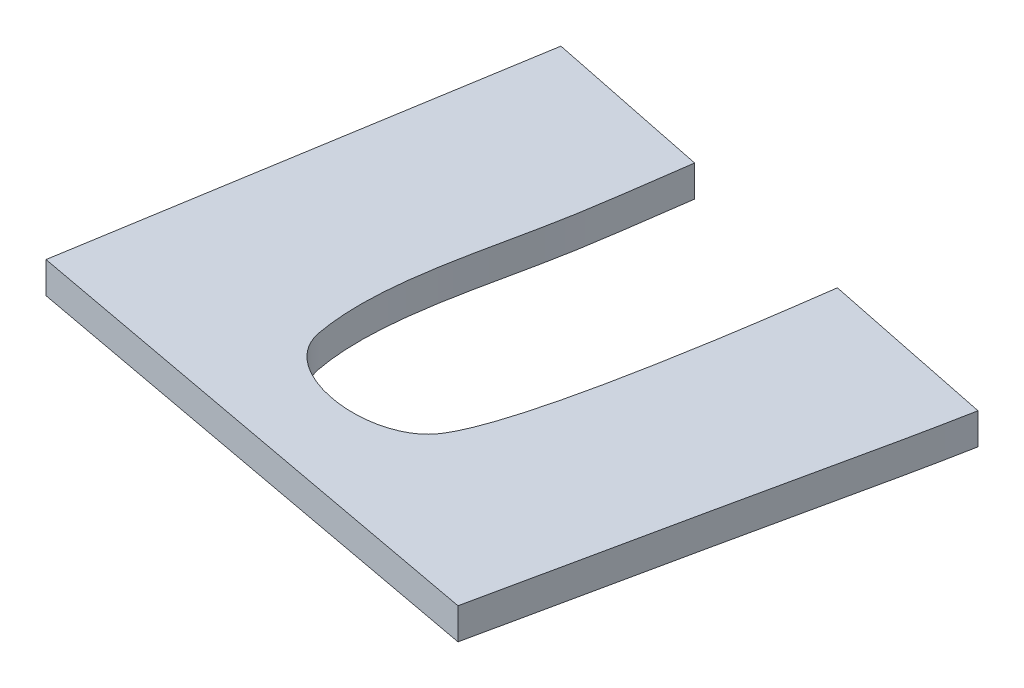
ISO-10303-21;
HEADER;
FILE_DESCRIPTION(('STEP AP214'),'2;1');
FILE_NAME('part.step','',(''),(''),'','','');
FILE_SCHEMA(('AUTOMOTIVE_DESIGN { 1 0 10303 214 1 1 1 1 }'));
ENDSEC;
DATA;
#1=APPLICATION_CONTEXT('core data for automotive mechanical design processes');
#2=APPLICATION_PROTOCOL_DEFINITION('international standard','automotive_design',2000,#1);
#3=PRODUCT_CONTEXT('',#1,'mechanical');
#4=PRODUCT('Part','Part','',(#3));
#5=PRODUCT_RELATED_PRODUCT_CATEGORY('part','',(#4));
#6=PRODUCT_DEFINITION_FORMATION('','',#4);
#7=PRODUCT_DEFINITION_CONTEXT('part definition',#1,'design');
#8=PRODUCT_DEFINITION('design','',#6,#7);
#9=PRODUCT_DEFINITION_SHAPE('','',#8);
#10=(LENGTH_UNIT() NAMED_UNIT(*) SI_UNIT(.MILLI.,.METRE.));
#11=(NAMED_UNIT(*) PLANE_ANGLE_UNIT() SI_UNIT($,.RADIAN.));
#12=(NAMED_UNIT(*) SI_UNIT($,.STERADIAN.) SOLID_ANGLE_UNIT());
#13=UNCERTAINTY_MEASURE_WITH_UNIT(LENGTH_MEASURE(1.E-05),#10,'distance_accuracy_value','');
#14=(GEOMETRIC_REPRESENTATION_CONTEXT(3) GLOBAL_UNCERTAINTY_ASSIGNED_CONTEXT((#13)) GLOBAL_UNIT_ASSIGNED_CONTEXT((#10,
#11,#12)) REPRESENTATION_CONTEXT('',''));
#15=CARTESIAN_POINT('',(0.,0.,0.));
#16=DIRECTION('',(0.,0.,1.));
#17=DIRECTION('',(1.,0.,0.));
#18=AXIS2_PLACEMENT_3D('',#15,#16,#17);
#19=CARTESIAN_POINT('',(62.4947593620138,1.,-34.1363669338565));
#20=DIRECTION('',(0.,1.,0.));
#21=DIRECTION('',(0.,0.,1.));
#22=AXIS2_PLACEMENT_3D('',#19,#20,#21);
#23=PLANE('',#22);
#24=DIRECTION('',(0.979714932282565,0.,0.200396236148708));
#25=VECTOR('',#24,1.);
#26=CARTESIAN_POINT('',(42.6861370275233,1.,18.4742417103642));
#27=LINE('',#26,#25);
#28=CARTESIAN_POINT('',(42.6861370275233,1.,18.4742417103642));
#29=VERTEX_POINT('',#28);
#30=CARTESIAN_POINT('',(48.0568926232576,1.,19.5728053549462));
#31=VERTEX_POINT('',#30);
#32=EDGE_CURVE('E76',#29,#31,#27,.T.);
#33=ORIENTED_EDGE('',*,*,#32,.F.);
#34=DIRECTION('',(-0.162010149383469,0.,0.986789091699308));
#35=VECTOR('',#34,1.);
#36=CARTESIAN_POINT('',(40.365492456671,1.,32.609076823737));
#37=LINE('',#36,#35);
#38=CARTESIAN_POINT('',(40.365492456671,1.,32.609076823737));
#39=VERTEX_POINT('',#38);
#40=EDGE_CURVE('E104',#29,#39,#37,.T.);
#41=ORIENTED_EDGE('',*,*,#40,.T.);
#42=DIRECTION('',(0.983229382627469,0.,0.182373191938966));
#43=VECTOR('',#42,1.);
#44=CARTESIAN_POINT('',(56.5304690779717,1.,35.6074192615589));
#45=LINE('',#44,#43);
#46=CARTESIAN_POINT('',(56.5304690779717,1.,35.6074192615589));
#47=VERTEX_POINT('',#46);
#48=EDGE_CURVE('E56',#39,#47,#45,.T.);
#49=ORIENTED_EDGE('',*,*,#48,.T.);
#50=CARTESIAN_POINT('',(56.5304690779717,1.,35.6074192615589));
#51=CARTESIAN_POINT('',(57.3126453660991,1.,31.9572632502975));
#52=CARTESIAN_POINT('',(58.0716806454936,1.,28.30207162409));
#53=CARTESIAN_POINT('',(58.876997942354,1.,24.6569512277746));
#54=CARTESIAN_POINT('',(59.9234402604844,1.,19.9204228404476));
#55=CARTESIAN_POINT('',(60.5564316908162,1.,15.1017995957529));
#56=CARTESIAN_POINT('',(61.3538895214243,1.,10.3170526121047));
#57=B_SPLINE_CURVE_WITH_KNOTS('',3,(#50,#51,#52,#53,#54,#55,#56),.UNSPECIFIED.,.F.,.F.,(4,3,4),
(0.,1.,2.),.UNSPECIFIED.);
#58=CARTESIAN_POINT('',(59.4417254807507,1.,21.9015211667061));
#59=VERTEX_POINT('',#58);
#60=EDGE_CURVE('E116',#47,#59,#57,.T.);
#61=ORIENTED_EDGE('',*,*,#60,.T.);
#62=CARTESIAN_POINT('',(53.7928520695256,1.,20.7460697871374));
#63=VERTEX_POINT('',#62);
#64=EDGE_CURVE('E109',#63,#59,#27,.T.);
#65=ORIENTED_EDGE('',*,*,#64,.F.);
#66=CARTESIAN_POINT('',(48.0568926232576,1.,19.5728053549462));
#67=CARTESIAN_POINT('',(47.8830756703404,1.,20.7460697871374));
#68=CARTESIAN_POINT('',(47.743941746051,1.,21.9249987548676));
#69=CARTESIAN_POINT('',(47.535441764506,1.,23.0925986515197));
#70=CARTESIAN_POINT('',(47.1317409506911,1.,25.3533232088831));
#71=CARTESIAN_POINT('',(46.3263180432598,1.,27.9143370772018));
#72=CARTESIAN_POINT('',(46.7532654763785,1.,30.2625479593547));
#73=CARTESIAN_POINT('',(47.0811649159948,1.,32.0659948772443));
#74=CARTESIAN_POINT('',(50.4846079667067,1.,32.4974454150202));
#75=CARTESIAN_POINT('',(51.4463232051432,1.,31.17508696217));
#76=CARTESIAN_POINT('',(52.6818935956574,1.,29.476177675213));
#77=CARTESIAN_POINT('',(53.7097051926669,1.,21.2553444078968));
#78=CARTESIAN_POINT('',(53.7928520695256,1.,20.7460697871374));
#79=B_SPLINE_CURVE_WITH_KNOTS('',3,(#66,#67,#68,#69,#70,#71,#72,#73,#74,#75,#76,#77,#78),
.UNSPECIFIED.,.F.,.F.,(4,3,3,3,4),(0.,1.,2.,3.,4.),.UNSPECIFIED.);
#80=EDGE_CURVE('E107',#31,#63,#79,.T.);
#81=ORIENTED_EDGE('',*,*,#80,.F.);
#82=EDGE_LOOP('',(#33,#41,#49,#61,#65,#81));
#83=FACE_BOUND('',#82,.T.);
#84=ADVANCED_FACE('F38',(#83),#23,.T.);
#85=CARTESIAN_POINT('',(62.4947593620138,0.,-34.1363669338565));
#86=DIRECTION('',(0.,1.,0.));
#87=DIRECTION('',(0.,0.,1.));
#88=AXIS2_PLACEMENT_3D('',#85,#86,#87);
#89=PLANE('',#88);
#90=DIRECTION('',(-0.162010149383469,0.,0.986789091699308));
#91=VECTOR('',#90,1.);
#92=CARTESIAN_POINT('',(40.365492456671,0.,32.609076823737));
#93=LINE('',#92,#91);
#94=CARTESIAN_POINT('',(42.6861370275233,0.,18.4742417103642));
#95=VERTEX_POINT('',#94);
#96=CARTESIAN_POINT('',(40.365492456671,0.,32.609076823737));
#97=VERTEX_POINT('',#96);
#98=EDGE_CURVE('E67',#95,#97,#93,.T.);
#99=ORIENTED_EDGE('',*,*,#98,.F.);
#100=DIRECTION('',(0.979714932282565,0.,0.200396236148708));
#101=VECTOR('',#100,1.);
#102=CARTESIAN_POINT('',(51.3701686668203,0.,20.2505209093113));
#103=LINE('',#102,#101);
#104=CARTESIAN_POINT('',(48.0568926232576,0.,19.5728053549462));
#105=VERTEX_POINT('',#104);
#106=EDGE_CURVE('E98',#95,#105,#103,.T.);
#107=ORIENTED_EDGE('',*,*,#106,.T.);
#108=CARTESIAN_POINT('',(48.0568926232576,0.,19.5728053549462));
#109=CARTESIAN_POINT('',(47.8830756703404,0.,20.7460697871374));
#110=CARTESIAN_POINT('',(47.743941746051,0.,21.9249987548676));
#111=CARTESIAN_POINT('',(47.535441764506,0.,23.0925986515197));
#112=CARTESIAN_POINT('',(47.1317409506911,0.,25.3533232088831));
#113=CARTESIAN_POINT('',(46.3263180432598,0.,27.9143370772018));
#114=CARTESIAN_POINT('',(46.7532654763785,0.,30.2625479593547));
#115=CARTESIAN_POINT('',(47.0811649159948,0.,32.0659948772443));
#116=CARTESIAN_POINT('',(50.4846079667067,0.,32.4974454150202));
#117=CARTESIAN_POINT('',(51.4463232051432,0.,31.17508696217));
#118=CARTESIAN_POINT('',(52.6818935956574,0.,29.476177675213));
#119=CARTESIAN_POINT('',(53.7097051926669,0.,21.2553444078968));
#120=CARTESIAN_POINT('',(53.7928520695256,0.,20.7460697871374));
#121=B_SPLINE_CURVE_WITH_KNOTS('',3,(#108,#109,#110,#111,#112,#113,#114,#115,#116,#117,#118,
#119,#120),.UNSPECIFIED.,.F.,.F.,(4,3,3,3,4),(0.,1.,2.,3.,4.),.UNSPECIFIED.);
#122=CARTESIAN_POINT('',(53.7928520695256,0.,20.7460697871374));
#123=VERTEX_POINT('',#122);
#124=EDGE_CURVE('E168',#105,#123,#121,.T.);
#125=ORIENTED_EDGE('',*,*,#124,.T.);
#126=CARTESIAN_POINT('',(59.4417254807507,0.,21.9015211667061));
#127=VERTEX_POINT('',#126);
#128=EDGE_CURVE('E169',#123,#127,#103,.T.);
#129=ORIENTED_EDGE('',*,*,#128,.T.);
#130=CARTESIAN_POINT('',(56.5304690779717,0.,35.6074192615589));
#131=CARTESIAN_POINT('',(57.3126453660991,0.,31.9572632502975));
#132=CARTESIAN_POINT('',(58.0716806454936,0.,28.30207162409));
#133=CARTESIAN_POINT('',(58.876997942354,0.,24.6569512277746));
#134=CARTESIAN_POINT('',(59.9234402604844,0.,19.9204228404476));
#135=CARTESIAN_POINT('',(60.5564316908162,0.,15.1017995957529));
#136=CARTESIAN_POINT('',(61.3538895214243,0.,10.3170526121047));
#137=B_SPLINE_CURVE_WITH_KNOTS('',3,(#130,#131,#132,#133,#134,#135,#136),.UNSPECIFIED.,.F.,.F.,
(4,3,4),(0.,1.,2.),.UNSPECIFIED.);
#138=CARTESIAN_POINT('',(56.5304690779717,0.,35.6074192615589));
#139=VERTEX_POINT('',#138);
#140=EDGE_CURVE('E112',#139,#127,#137,.T.);
#141=ORIENTED_EDGE('',*,*,#140,.F.);
#142=DIRECTION('',(0.983229382627469,0.,0.182373191938966));
#143=VECTOR('',#142,1.);
#144=CARTESIAN_POINT('',(56.5304690779717,0.,35.6074192615589));
#145=LINE('',#144,#143);
#146=EDGE_CURVE('E119',#97,#139,#145,.T.);
#147=ORIENTED_EDGE('',*,*,#146,.F.);
#148=EDGE_LOOP('',(#99,#107,#125,#129,#141,#147));
#149=FACE_BOUND('',#148,.T.);
#150=ADVANCED_FACE('F141',(#149),#89,.F.);
#151=CARTESIAN_POINT('',(40.365492456671,1.,32.609076823737));
#152=DIRECTION('',(0.986789091699309,0.,0.162010149383469));
#153=DIRECTION('',(0.162010149383469,0.,-0.986789091699309));
#154=AXIS2_PLACEMENT_3D('',#151,#152,#153);
#155=PLANE('',#154);
#156=ORIENTED_EDGE('',*,*,#40,.F.);
#157=DIRECTION('',(0.,1.,0.));
#158=VECTOR('',#157,1.);
#159=CARTESIAN_POINT('',(42.6861370275233,-9.,18.4742417103642));
#160=LINE('',#159,#158);
#161=EDGE_CURVE('E95',#95,#29,#160,.T.);
#162=ORIENTED_EDGE('',*,*,#161,.F.);
#163=ORIENTED_EDGE('',*,*,#98,.T.);
#164=DIRECTION('',(0.,-1.,0.));
#165=VECTOR('',#164,1.);
#166=CARTESIAN_POINT('',(40.365492456671,1.,32.609076823737));
#167=LINE('',#166,#165);
#168=EDGE_CURVE('E11',#39,#97,#167,.T.);
#169=ORIENTED_EDGE('',*,*,#168,.F.);
#170=EDGE_LOOP('',(#156,#162,#163,#169));
#171=FACE_BOUND('',#170,.T.);
#172=ADVANCED_FACE('F40',(#171),#155,.F.);
#173=CARTESIAN_POINT('',(56.5304690779717,1.,35.6074192615589));
#174=DIRECTION('',(0.182373191938966,0.,-0.983229382627469));
#175=DIRECTION('',(-0.983229382627469,0.,-0.182373191938966));
#176=AXIS2_PLACEMENT_3D('',#173,#174,#175);
#177=PLANE('',#176);
#178=ORIENTED_EDGE('',*,*,#146,.T.);
#179=DIRECTION('',(0.,-1.,0.));
#180=VECTOR('',#179,1.);
#181=CARTESIAN_POINT('',(56.5304690779717,1.,35.6074192615589));
#182=LINE('',#181,#180);
#183=EDGE_CURVE('E48',#47,#139,#182,.T.);
#184=ORIENTED_EDGE('',*,*,#183,.F.);
#185=ORIENTED_EDGE('',*,*,#48,.F.);
#186=ORIENTED_EDGE('',*,*,#168,.T.);
#187=EDGE_LOOP('',(#178,#184,#185,#186));
#188=FACE_BOUND('',#187,.T.);
#189=ADVANCED_FACE('F139',(#188),#177,.F.);
#190=DIRECTION('',(0.,-1.,0.));
#191=VECTOR('',#190,1.);
#192=SURFACE_OF_LINEAR_EXTRUSION('',#57,#191);
#193=ORIENTED_EDGE('',*,*,#140,.T.);
#194=DIRECTION('',(0.,1.,0.));
#195=VECTOR('',#194,1.);
#196=CARTESIAN_POINT('',(59.4417254807507,-9.,21.9015211667061));
#197=LINE('',#196,#195);
#198=EDGE_CURVE('E101',#127,#59,#197,.T.);
#199=ORIENTED_EDGE('',*,*,#198,.T.);
#200=ORIENTED_EDGE('',*,*,#60,.F.);
#201=ORIENTED_EDGE('',*,*,#183,.T.);
#202=EDGE_LOOP('',(#193,#199,#200,#201));
#203=FACE_BOUND('',#202,.T.);
#204=ADVANCED_FACE('F135',(#203),#192,.F.);
#205=DIRECTION('',(0.,-1.,0.));
#206=VECTOR('',#205,1.);
#207=SURFACE_OF_LINEAR_EXTRUSION('',#79,#206);
#208=ORIENTED_EDGE('',*,*,#124,.F.);
#209=DIRECTION('',(0.,-1.,0.));
#210=VECTOR('',#209,1.);
#211=CARTESIAN_POINT('',(48.0568926232576,1.,19.5728053549462));
#212=LINE('',#211,#210);
#213=EDGE_CURVE('E167',#31,#105,#212,.T.);
#214=ORIENTED_EDGE('',*,*,#213,.F.);
#215=ORIENTED_EDGE('',*,*,#80,.T.);
#216=DIRECTION('',(0.,-1.,0.));
#217=VECTOR('',#216,1.);
#218=CARTESIAN_POINT('',(53.7928520695256,1.,20.7460697871374));
#219=LINE('',#218,#217);
#220=EDGE_CURVE('E122',#63,#123,#219,.T.);
#221=ORIENTED_EDGE('',*,*,#220,.T.);
#222=EDGE_LOOP('',(#208,#214,#215,#221));
#223=FACE_BOUND('',#222,.T.);
#224=ADVANCED_FACE('F138',(#223),#207,.T.);
#225=CARTESIAN_POINT('',(42.6861370275233,-9.,18.4742417103642));
#226=DIRECTION('',(-0.200396236148708,0.,0.979714932282565));
#227=DIRECTION('',(0.979714932282565,0.,0.200396236148708));
#228=AXIS2_PLACEMENT_3D('',#225,#226,#227);
#229=PLANE('',#228);
#230=ORIENTED_EDGE('',*,*,#220,.F.);
#231=ORIENTED_EDGE('',*,*,#64,.T.);
#232=ORIENTED_EDGE('',*,*,#198,.F.);
#233=ORIENTED_EDGE('',*,*,#128,.F.);
#234=EDGE_LOOP('',(#230,#231,#232,#233));
#235=FACE_BOUND('',#234,.T.);
#236=ADVANCED_FACE('F159',(#235),#229,.F.);
#237=ORIENTED_EDGE('',*,*,#161,.T.);
#238=ORIENTED_EDGE('',*,*,#32,.T.);
#239=ORIENTED_EDGE('',*,*,#213,.T.);
#240=ORIENTED_EDGE('',*,*,#106,.F.);
#241=EDGE_LOOP('',(#237,#238,#239,#240));
#242=FACE_BOUND('',#241,.T.);
#243=ADVANCED_FACE('F96',(#242),#229,.F.);
#244=CLOSED_SHELL('',(#84,#150,#172,#189,#204,#224,#236,#243));
#245=MANIFOLD_SOLID_BREP('B2',#244);
#246=ADVANCED_BREP_SHAPE_REPRESENTATION('',(#18,#245),#14);
#247=SHAPE_DEFINITION_REPRESENTATION(#9,#246);
ENDSEC;
END-ISO-10303-21;
